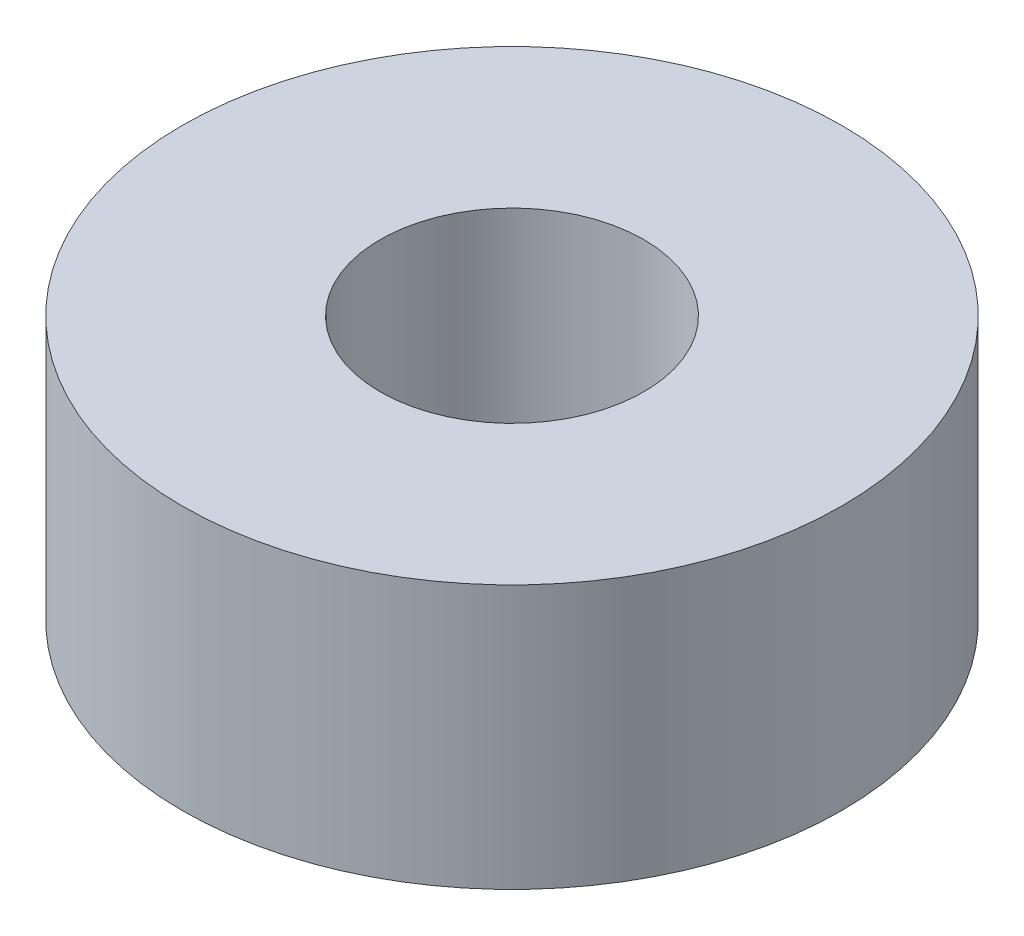
ISO-10303-21;
HEADER;
FILE_DESCRIPTION(('STEP AP214'),'2;1');
FILE_NAME('part.step','',(''),(''),'','','');
FILE_SCHEMA(('AUTOMOTIVE_DESIGN { 1 0 10303 214 1 1 1 1 }'));
ENDSEC;
DATA;
#1=APPLICATION_CONTEXT('core data for automotive mechanical design processes');
#2=APPLICATION_PROTOCOL_DEFINITION('international standard','automotive_design',2000,#1);
#3=PRODUCT_CONTEXT('',#1,'mechanical');
#4=PRODUCT('Part','Part','',(#3));
#5=PRODUCT_RELATED_PRODUCT_CATEGORY('part','',(#4));
#6=PRODUCT_DEFINITION_FORMATION('','',#4);
#7=PRODUCT_DEFINITION_CONTEXT('part definition',#1,'design');
#8=PRODUCT_DEFINITION('design','',#6,#7);
#9=PRODUCT_DEFINITION_SHAPE('','',#8);
#10=(LENGTH_UNIT() NAMED_UNIT(*) SI_UNIT(.MILLI.,.METRE.));
#11=(NAMED_UNIT(*) PLANE_ANGLE_UNIT() SI_UNIT($,.RADIAN.));
#12=(NAMED_UNIT(*) SI_UNIT($,.STERADIAN.) SOLID_ANGLE_UNIT());
#13=UNCERTAINTY_MEASURE_WITH_UNIT(LENGTH_MEASURE(1.E-05),#10,'distance_accuracy_value','');
#14=(GEOMETRIC_REPRESENTATION_CONTEXT(3) GLOBAL_UNCERTAINTY_ASSIGNED_CONTEXT((#13)) GLOBAL_UNIT_ASSIGNED_CONTEXT((#10,
#11,#12)) REPRESENTATION_CONTEXT('',''));
#15=CARTESIAN_POINT('',(0.,0.,0.));
#16=DIRECTION('',(0.,0.,1.));
#17=DIRECTION('',(1.,0.,0.));
#18=AXIS2_PLACEMENT_3D('',#15,#16,#17);
#19=CARTESIAN_POINT('',(0.,4.,0.));
#20=DIRECTION('',(0.,1.,0.));
#21=DIRECTION('',(0.,0.,1.));
#22=AXIS2_PLACEMENT_3D('',#19,#20,#21);
#23=PLANE('',#22);
#24=CARTESIAN_POINT('',(0.,4.,0.));
#25=DIRECTION('',(0.,1.,0.));
#26=DIRECTION('',(0.,0.,1.));
#27=AXIS2_PLACEMENT_3D('',#24,#25,#26);
#28=CIRCLE('',#27,5.);
#29=CARTESIAN_POINT('',(0.,4.,5.));
#30=VERTEX_POINT('',#29);
#31=EDGE_CURVE('E10',#30,#30,#28,.T.);
#32=ORIENTED_EDGE('',*,*,#31,.T.);
#33=EDGE_LOOP('',(#32));
#34=FACE_BOUND('',#33,.T.);
#35=CARTESIAN_POINT('',(0.,4.,0.));
#36=DIRECTION('',(0.,1.,0.));
#37=DIRECTION('',(0.,0.,1.));
#38=AXIS2_PLACEMENT_3D('',#35,#36,#37);
#39=CIRCLE('',#38,2.);
#40=CARTESIAN_POINT('',(0.,4.,2.));
#41=VERTEX_POINT('',#40);
#42=EDGE_CURVE('E51',#41,#41,#39,.T.);
#43=ORIENTED_EDGE('',*,*,#42,.F.);
#44=EDGE_LOOP('',(#43));
#45=FACE_BOUND('',#44,.T.);
#46=ADVANCED_FACE('F40',(#34,#45),#23,.T.);
#47=CARTESIAN_POINT('',(0.,0.,0.));
#48=DIRECTION('',(0.,1.,0.));
#49=DIRECTION('',(0.,0.,1.));
#50=AXIS2_PLACEMENT_3D('',#47,#48,#49);
#51=PLANE('',#50);
#52=CARTESIAN_POINT('',(0.,0.,0.));
#53=DIRECTION('',(0.,1.,0.));
#54=DIRECTION('',(0.,0.,1.));
#55=AXIS2_PLACEMENT_3D('',#52,#53,#54);
#56=CIRCLE('',#55,5.);
#57=CARTESIAN_POINT('',(0.,0.,5.));
#58=VERTEX_POINT('',#57);
#59=EDGE_CURVE('E44',#58,#58,#56,.T.);
#60=ORIENTED_EDGE('',*,*,#59,.F.);
#61=EDGE_LOOP('',(#60));
#62=FACE_BOUND('',#61,.T.);
#63=CARTESIAN_POINT('',(0.,0.,0.));
#64=DIRECTION('',(0.,1.,0.));
#65=DIRECTION('',(0.,0.,1.));
#66=AXIS2_PLACEMENT_3D('',#63,#64,#65);
#67=CIRCLE('',#66,2.);
#68=CARTESIAN_POINT('',(0.,0.,2.));
#69=VERTEX_POINT('',#68);
#70=EDGE_CURVE('E53',#69,#69,#67,.T.);
#71=ORIENTED_EDGE('',*,*,#70,.T.);
#72=EDGE_LOOP('',(#71));
#73=FACE_BOUND('',#72,.T.);
#74=ADVANCED_FACE('F63',(#62,#73),#51,.F.);
#75=CARTESIAN_POINT('',(0.,4.,0.));
#76=DIRECTION('',(0.,-1.,0.));
#77=DIRECTION('',(0.,0.,-1.));
#78=AXIS2_PLACEMENT_3D('',#75,#76,#77);
#79=CYLINDRICAL_SURFACE('',#78,5.);
#80=ORIENTED_EDGE('',*,*,#31,.F.);
#81=EDGE_LOOP('',(#80));
#82=FACE_BOUND('',#81,.T.);
#83=ORIENTED_EDGE('',*,*,#59,.T.);
#84=EDGE_LOOP('',(#83));
#85=FACE_BOUND('',#84,.T.);
#86=ADVANCED_FACE('F42',(#82,#85),#79,.T.);
#87=CARTESIAN_POINT('',(0.,4.,0.));
#88=DIRECTION('',(0.,-1.,0.));
#89=DIRECTION('',(0.,0.,-1.));
#90=AXIS2_PLACEMENT_3D('',#87,#88,#89);
#91=CYLINDRICAL_SURFACE('',#90,2.);
#92=ORIENTED_EDGE('',*,*,#42,.T.);
#93=EDGE_LOOP('',(#92));
#94=FACE_BOUND('',#93,.T.);
#95=ORIENTED_EDGE('',*,*,#70,.F.);
#96=EDGE_LOOP('',(#95));
#97=FACE_BOUND('',#96,.T.);
#98=ADVANCED_FACE('F59',(#94,#97),#91,.F.);
#99=CLOSED_SHELL('',(#46,#74,#86,#98));
#100=MANIFOLD_SOLID_BREP('B2',#99);
#101=ADVANCED_BREP_SHAPE_REPRESENTATION('',(#18,#100),#14);
#102=SHAPE_DEFINITION_REPRESENTATION(#9,#101);
ENDSEC;
END-ISO-10303-21;
